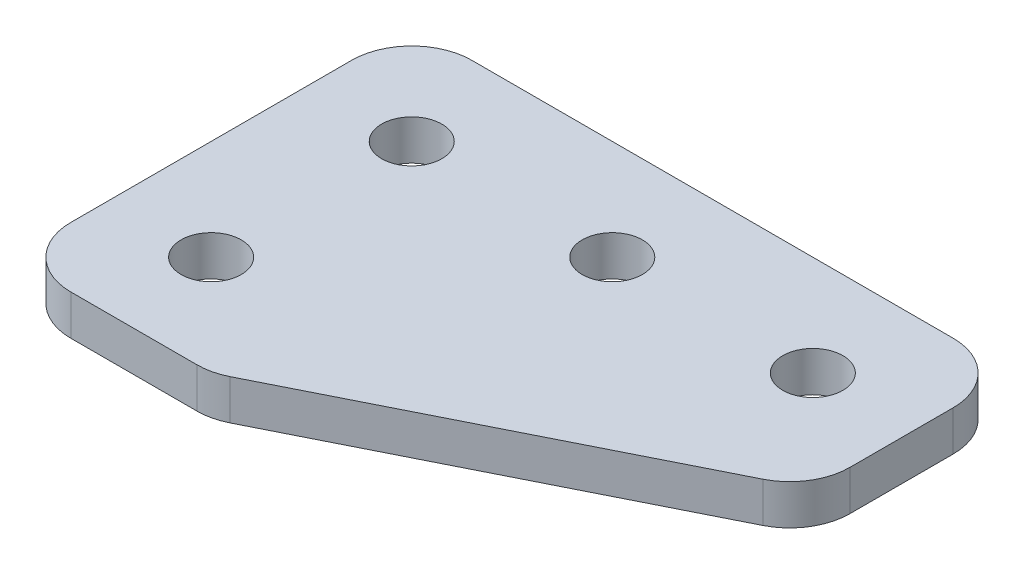
ISO-10303-21;
HEADER;
FILE_DESCRIPTION(('STEP AP214'),'2;1');
FILE_NAME('part.step','',(''),(''),'','','');
FILE_SCHEMA(('AUTOMOTIVE_DESIGN { 1 0 10303 214 1 1 1 1 }'));
ENDSEC;
DATA;
#1=APPLICATION_CONTEXT('core data for automotive mechanical design processes');
#2=APPLICATION_PROTOCOL_DEFINITION('international standard','automotive_design',2000,#1);
#3=PRODUCT_CONTEXT('',#1,'mechanical');
#4=PRODUCT('Part','Part','',(#3));
#5=PRODUCT_RELATED_PRODUCT_CATEGORY('part','',(#4));
#6=PRODUCT_DEFINITION_FORMATION('','',#4);
#7=PRODUCT_DEFINITION_CONTEXT('part definition',#1,'design');
#8=PRODUCT_DEFINITION('design','',#6,#7);
#9=PRODUCT_DEFINITION_SHAPE('','',#8);
#10=(LENGTH_UNIT() NAMED_UNIT(*) SI_UNIT(.MILLI.,.METRE.));
#11=(NAMED_UNIT(*) PLANE_ANGLE_UNIT() SI_UNIT($,.RADIAN.));
#12=(NAMED_UNIT(*) SI_UNIT($,.STERADIAN.) SOLID_ANGLE_UNIT());
#13=UNCERTAINTY_MEASURE_WITH_UNIT(LENGTH_MEASURE(1.E-05),#10,'distance_accuracy_value','');
#14=(GEOMETRIC_REPRESENTATION_CONTEXT(3) GLOBAL_UNCERTAINTY_ASSIGNED_CONTEXT((#13)) GLOBAL_UNIT_ASSIGNED_CONTEXT((#10,
#11,#12)) REPRESENTATION_CONTEXT('',''));
#15=CARTESIAN_POINT('',(0.,0.,0.));
#16=DIRECTION('',(0.,0.,1.));
#17=DIRECTION('',(1.,0.,0.));
#18=AXIS2_PLACEMENT_3D('',#15,#16,#17);
#19=CARTESIAN_POINT('',(0.,2.,0.));
#20=DIRECTION('',(0.,-1.,0.));
#21=DIRECTION('',(0.,0.,-1.));
#22=AXIS2_PLACEMENT_3D('',#19,#20,#21);
#23=PLANE('',#22);
#24=DIRECTION('',(0.894427190999916,0.,-0.447213595499958));
#25=VECTOR('',#24,1.);
#26=CARTESIAN_POINT('',(0.,2.,10.));
#27=LINE('',#26,#25);
#28=CARTESIAN_POINT('',(0.633436854000507,2.,9.68328157299975));
#29=VERTEX_POINT('',#28);
#30=CARTESIAN_POINT('',(18.3416407864999,2.,0.829179606750061));
#31=VERTEX_POINT('',#30);
#32=EDGE_CURVE('E158',#29,#31,#27,.T.);
#33=ORIENTED_EDGE('',*,*,#32,.T.);
#34=CARTESIAN_POINT('',(17.,2.,-1.85410196624968));
#35=DIRECTION('',(0.,-1.,0.));
#36=DIRECTION('',(0.,0.,-1.));
#37=AXIS2_PLACEMENT_3D('',#34,#35,#36);
#38=CIRCLE('',#37,3.);
#39=CARTESIAN_POINT('',(20.,2.,-1.85410196624968));
#40=VERTEX_POINT('',#39);
#41=EDGE_CURVE('E181',#31,#40,#38,.F.);
#42=ORIENTED_EDGE('',*,*,#41,.T.);
#43=DIRECTION('',(0.,0.,-1.));
#44=VECTOR('',#43,1.);
#45=CARTESIAN_POINT('',(20.,2.,0.));
#46=LINE('',#45,#44);
#47=CARTESIAN_POINT('',(20.,2.,-7.00000000000001));
#48=VERTEX_POINT('',#47);
#49=EDGE_CURVE('E140',#40,#48,#46,.T.);
#50=ORIENTED_EDGE('',*,*,#49,.T.);
#51=CARTESIAN_POINT('',(17.,2.,-7.00000000000001));
#52=DIRECTION('',(0.,-1.,0.));
#53=DIRECTION('',(0.,0.,-1.));
#54=AXIS2_PLACEMENT_3D('',#51,#52,#53);
#55=CIRCLE('',#54,3.);
#56=CARTESIAN_POINT('',(17.,2.,-10.));
#57=VERTEX_POINT('',#56);
#58=EDGE_CURVE('E179',#48,#57,#55,.F.);
#59=ORIENTED_EDGE('',*,*,#58,.T.);
#60=DIRECTION('',(-1.,0.,0.));
#61=VECTOR('',#60,1.);
#62=CARTESIAN_POINT('',(0.,2.,-10.));
#63=LINE('',#62,#61);
#64=CARTESIAN_POINT('',(-7.,2.,-10.));
#65=VERTEX_POINT('',#64);
#66=EDGE_CURVE('E196',#57,#65,#63,.T.);
#67=ORIENTED_EDGE('',*,*,#66,.T.);
#68=CARTESIAN_POINT('',(-7.,2.,-7.));
#69=DIRECTION('',(0.,-1.,0.));
#70=DIRECTION('',(0.,0.,-1.));
#71=AXIS2_PLACEMENT_3D('',#68,#69,#70);
#72=CIRCLE('',#71,3.);
#73=CARTESIAN_POINT('',(-10.,2.,-7.));
#74=VERTEX_POINT('',#73);
#75=EDGE_CURVE('E176',#65,#74,#72,.F.);
#76=ORIENTED_EDGE('',*,*,#75,.T.);
#77=DIRECTION('',(0.,0.,1.));
#78=VECTOR('',#77,1.);
#79=CARTESIAN_POINT('',(-10.,2.,-10.));
#80=LINE('',#79,#78);
#81=CARTESIAN_POINT('',(-10.,2.,7.));
#82=VERTEX_POINT('',#81);
#83=EDGE_CURVE('E206',#74,#82,#80,.T.);
#84=ORIENTED_EDGE('',*,*,#83,.T.);
#85=CARTESIAN_POINT('',(-7.,2.,7.));
#86=DIRECTION('',(0.,-1.,0.));
#87=DIRECTION('',(0.,0.,-1.));
#88=AXIS2_PLACEMENT_3D('',#85,#86,#87);
#89=CIRCLE('',#88,3.);
#90=CARTESIAN_POINT('',(-7.,2.,10.));
#91=VERTEX_POINT('',#90);
#92=EDGE_CURVE('E65',#82,#91,#89,.F.);
#93=ORIENTED_EDGE('',*,*,#92,.T.);
#94=DIRECTION('',(1.,0.,0.));
#95=VECTOR('',#94,1.);
#96=CARTESIAN_POINT('',(-10.,2.,10.));
#97=LINE('',#96,#95);
#98=CARTESIAN_POINT('',(-0.708203932499367,2.,10.));
#99=VERTEX_POINT('',#98);
#100=EDGE_CURVE('E217',#91,#99,#97,.T.);
#101=ORIENTED_EDGE('',*,*,#100,.T.);
#102=CARTESIAN_POINT('',(-0.708203932499368,2.,7.));
#103=DIRECTION('',(0.,-1.,0.));
#104=DIRECTION('',(0.,0.,-1.));
#105=AXIS2_PLACEMENT_3D('',#102,#103,#104);
#106=CIRCLE('',#105,3.);
#107=EDGE_CURVE('E182',#99,#29,#106,.F.);
#108=ORIENTED_EDGE('',*,*,#107,.T.);
#109=EDGE_LOOP('',(#33,#42,#50,#59,#67,#76,#84,#93,#101,#108));
#110=FACE_BOUND('',#109,.T.);
#111=CARTESIAN_POINT('',(5.,2.,-5.));
#112=DIRECTION('',(0.,1.,0.));
#113=DIRECTION('',(0.,0.,1.));
#114=AXIS2_PLACEMENT_3D('',#111,#112,#113);
#115=CIRCLE('',#114,1.5);
#116=CARTESIAN_POINT('',(5.,2.,-3.5));
#117=VERTEX_POINT('',#116);
#118=EDGE_CURVE('E149',#117,#117,#115,.T.);
#119=ORIENTED_EDGE('',*,*,#118,.F.);
#120=EDGE_LOOP('',(#119));
#121=FACE_BOUND('',#120,.T.);
#122=CARTESIAN_POINT('',(15.,2.,-5.));
#123=DIRECTION('',(0.,1.,0.));
#124=DIRECTION('',(0.,0.,1.));
#125=AXIS2_PLACEMENT_3D('',#122,#123,#124);
#126=CIRCLE('',#125,1.5);
#127=CARTESIAN_POINT('',(15.,2.,-3.5));
#128=VERTEX_POINT('',#127);
#129=EDGE_CURVE('E221',#128,#128,#126,.T.);
#130=ORIENTED_EDGE('',*,*,#129,.F.);
#131=EDGE_LOOP('',(#130));
#132=FACE_BOUND('',#131,.T.);
#133=CARTESIAN_POINT('',(-5.,2.,-5.));
#134=DIRECTION('',(0.,1.,0.));
#135=DIRECTION('',(0.,0.,1.));
#136=AXIS2_PLACEMENT_3D('',#133,#134,#135);
#137=CIRCLE('',#136,1.5);
#138=CARTESIAN_POINT('',(-5.,2.,-3.5));
#139=VERTEX_POINT('',#138);
#140=EDGE_CURVE('E226',#139,#139,#137,.T.);
#141=ORIENTED_EDGE('',*,*,#140,.F.);
#142=EDGE_LOOP('',(#141));
#143=FACE_BOUND('',#142,.T.);
#144=CARTESIAN_POINT('',(-5.,2.,5.));
#145=DIRECTION('',(0.,1.,0.));
#146=DIRECTION('',(0.,0.,1.));
#147=AXIS2_PLACEMENT_3D('',#144,#145,#146);
#148=CIRCLE('',#147,1.5);
#149=CARTESIAN_POINT('',(-5.,2.,6.5));
#150=VERTEX_POINT('',#149);
#151=EDGE_CURVE('E235',#150,#150,#148,.T.);
#152=ORIENTED_EDGE('',*,*,#151,.F.);
#153=EDGE_LOOP('',(#152));
#154=FACE_BOUND('',#153,.T.);
#155=ADVANCED_FACE('F41',(#110,#121,#132,#143,#154),#23,.F.);
#156=CARTESIAN_POINT('',(0.,0.,0.));
#157=DIRECTION('',(0.,-1.,0.));
#158=DIRECTION('',(0.,0.,-1.));
#159=AXIS2_PLACEMENT_3D('',#156,#157,#158);
#160=PLANE('',#159);
#161=CARTESIAN_POINT('',(-5.,0.,-5.));
#162=DIRECTION('',(0.,1.,0.));
#163=DIRECTION('',(0.,0.,1.));
#164=AXIS2_PLACEMENT_3D('',#161,#162,#163);
#165=CIRCLE('',#164,1.5);
#166=CARTESIAN_POINT('',(-5.,0.,-3.5));
#167=VERTEX_POINT('',#166);
#168=EDGE_CURVE('E232',#167,#167,#165,.T.);
#169=ORIENTED_EDGE('',*,*,#168,.T.);
#170=EDGE_LOOP('',(#169));
#171=FACE_BOUND('',#170,.T.);
#172=CARTESIAN_POINT('',(5.,0.,-5.));
#173=DIRECTION('',(0.,1.,0.));
#174=DIRECTION('',(0.,0.,1.));
#175=AXIS2_PLACEMENT_3D('',#172,#173,#174);
#176=CIRCLE('',#175,1.5);
#177=CARTESIAN_POINT('',(5.,0.,-3.5));
#178=VERTEX_POINT('',#177);
#179=EDGE_CURVE('E154',#178,#178,#176,.T.);
#180=ORIENTED_EDGE('',*,*,#179,.T.);
#181=EDGE_LOOP('',(#180));
#182=FACE_BOUND('',#181,.T.);
#183=DIRECTION('',(0.,0.,-1.));
#184=VECTOR('',#183,1.);
#185=CARTESIAN_POINT('',(20.,0.,0.));
#186=LINE('',#185,#184);
#187=CARTESIAN_POINT('',(20.,0.,-1.85410196624968));
#188=VERTEX_POINT('',#187);
#189=CARTESIAN_POINT('',(20.,0.,-7.00000000000001));
#190=VERTEX_POINT('',#189);
#191=EDGE_CURVE('E137',#188,#190,#186,.T.);
#192=ORIENTED_EDGE('',*,*,#191,.F.);
#193=CARTESIAN_POINT('',(17.,0.,-1.85410196624968));
#194=DIRECTION('',(0.,-1.,0.));
#195=DIRECTION('',(0.,0.,-1.));
#196=AXIS2_PLACEMENT_3D('',#193,#194,#195);
#197=CIRCLE('',#196,3.);
#198=CARTESIAN_POINT('',(18.3416407864999,0.,0.829179606750061));
#199=VERTEX_POINT('',#198);
#200=EDGE_CURVE('E118',#188,#199,#197,.T.);
#201=ORIENTED_EDGE('',*,*,#200,.T.);
#202=DIRECTION('',(0.894427190999916,0.,-0.447213595499958));
#203=VECTOR('',#202,1.);
#204=CARTESIAN_POINT('',(0.,0.,10.));
#205=LINE('',#204,#203);
#206=CARTESIAN_POINT('',(0.633436854000507,0.,9.68328157299975));
#207=VERTEX_POINT('',#206);
#208=EDGE_CURVE('E164',#207,#199,#205,.T.);
#209=ORIENTED_EDGE('',*,*,#208,.F.);
#210=CARTESIAN_POINT('',(-0.708203932499368,0.,7.));
#211=DIRECTION('',(0.,-1.,0.));
#212=DIRECTION('',(0.,0.,-1.));
#213=AXIS2_PLACEMENT_3D('',#210,#211,#212);
#214=CIRCLE('',#213,3.);
#215=CARTESIAN_POINT('',(-0.708203932499367,0.,10.));
#216=VERTEX_POINT('',#215);
#217=EDGE_CURVE('E132',#207,#216,#214,.T.);
#218=ORIENTED_EDGE('',*,*,#217,.T.);
#219=DIRECTION('',(1.,0.,0.));
#220=VECTOR('',#219,1.);
#221=CARTESIAN_POINT('',(-10.,0.,10.));
#222=LINE('',#221,#220);
#223=CARTESIAN_POINT('',(-7.,0.,10.));
#224=VERTEX_POINT('',#223);
#225=EDGE_CURVE('E162',#224,#216,#222,.T.);
#226=ORIENTED_EDGE('',*,*,#225,.F.);
#227=CARTESIAN_POINT('',(-7.,0.,7.));
#228=DIRECTION('',(0.,-1.,0.));
#229=DIRECTION('',(0.,0.,-1.));
#230=AXIS2_PLACEMENT_3D('',#227,#228,#229);
#231=CIRCLE('',#230,3.);
#232=CARTESIAN_POINT('',(-10.,0.,7.));
#233=VERTEX_POINT('',#232);
#234=EDGE_CURVE('E168',#224,#233,#231,.T.);
#235=ORIENTED_EDGE('',*,*,#234,.T.);
#236=DIRECTION('',(0.,0.,1.));
#237=VECTOR('',#236,1.);
#238=CARTESIAN_POINT('',(-10.,0.,0.));
#239=LINE('',#238,#237);
#240=CARTESIAN_POINT('',(-10.,0.,-7.));
#241=VERTEX_POINT('',#240);
#242=EDGE_CURVE('E155',#241,#233,#239,.T.);
#243=ORIENTED_EDGE('',*,*,#242,.F.);
#244=CARTESIAN_POINT('',(-7.,0.,-7.));
#245=DIRECTION('',(0.,-1.,0.));
#246=DIRECTION('',(0.,0.,-1.));
#247=AXIS2_PLACEMENT_3D('',#244,#245,#246);
#248=CIRCLE('',#247,3.);
#249=CARTESIAN_POINT('',(-7.,0.,-10.));
#250=VERTEX_POINT('',#249);
#251=EDGE_CURVE('E143',#241,#250,#248,.T.);
#252=ORIENTED_EDGE('',*,*,#251,.T.);
#253=DIRECTION('',(-1.,0.,0.));
#254=VECTOR('',#253,1.);
#255=CARTESIAN_POINT('',(0.,0.,-10.));
#256=LINE('',#255,#254);
#257=CARTESIAN_POINT('',(17.,0.,-10.));
#258=VERTEX_POINT('',#257);
#259=EDGE_CURVE('E146',#258,#250,#256,.T.);
#260=ORIENTED_EDGE('',*,*,#259,.F.);
#261=CARTESIAN_POINT('',(17.,0.,-7.00000000000001));
#262=DIRECTION('',(0.,-1.,0.));
#263=DIRECTION('',(0.,0.,-1.));
#264=AXIS2_PLACEMENT_3D('',#261,#262,#263);
#265=CIRCLE('',#264,3.);
#266=EDGE_CURVE('E150',#258,#190,#265,.T.);
#267=ORIENTED_EDGE('',*,*,#266,.T.);
#268=EDGE_LOOP('',(#192,#201,#209,#218,#226,#235,#243,#252,#260,#267));
#269=FACE_BOUND('',#268,.T.);
#270=CARTESIAN_POINT('',(15.,0.,-5.));
#271=DIRECTION('',(0.,1.,0.));
#272=DIRECTION('',(0.,0.,1.));
#273=AXIS2_PLACEMENT_3D('',#270,#271,#272);
#274=CIRCLE('',#273,1.5);
#275=CARTESIAN_POINT('',(15.,0.,-3.5));
#276=VERTEX_POINT('',#275);
#277=EDGE_CURVE('E227',#276,#276,#274,.T.);
#278=ORIENTED_EDGE('',*,*,#277,.T.);
#279=EDGE_LOOP('',(#278));
#280=FACE_BOUND('',#279,.T.);
#281=CARTESIAN_POINT('',(-5.,0.,5.));
#282=DIRECTION('',(0.,1.,0.));
#283=DIRECTION('',(0.,0.,1.));
#284=AXIS2_PLACEMENT_3D('',#281,#282,#283);
#285=CIRCLE('',#284,1.5);
#286=CARTESIAN_POINT('',(-5.,0.,6.5));
#287=VERTEX_POINT('',#286);
#288=EDGE_CURVE('E236',#287,#287,#285,.T.);
#289=ORIENTED_EDGE('',*,*,#288,.T.);
#290=EDGE_LOOP('',(#289));
#291=FACE_BOUND('',#290,.T.);
#292=ADVANCED_FACE('F145',(#171,#182,#269,#280,#291),#160,.T.);
#293=CARTESIAN_POINT('',(20.,2.,0.));
#294=DIRECTION('',(-1.,0.,0.));
#295=DIRECTION('',(0.,0.,1.));
#296=AXIS2_PLACEMENT_3D('',#293,#294,#295);
#297=PLANE('',#296);
#298=ORIENTED_EDGE('',*,*,#49,.F.);
#299=DIRECTION('',(0.,-1.,0.));
#300=VECTOR('',#299,1.);
#301=CARTESIAN_POINT('',(20.,2.,-1.85410196624968));
#302=LINE('',#301,#300);
#303=EDGE_CURVE('E123',#40,#188,#302,.T.);
#304=ORIENTED_EDGE('',*,*,#303,.T.);
#305=ORIENTED_EDGE('',*,*,#191,.T.);
#306=DIRECTION('',(0.,-1.,0.));
#307=VECTOR('',#306,1.);
#308=CARTESIAN_POINT('',(20.,2.,-7.00000000000001));
#309=LINE('',#308,#307);
#310=EDGE_CURVE('E142',#190,#48,#309,.F.);
#311=ORIENTED_EDGE('',*,*,#310,.T.);
#312=EDGE_LOOP('',(#298,#304,#305,#311));
#313=FACE_BOUND('',#312,.T.);
#314=ADVANCED_FACE('F136',(#313),#297,.F.);
#315=CARTESIAN_POINT('',(0.,2.,-10.));
#316=DIRECTION('',(0.,0.,1.));
#317=DIRECTION('',(1.,0.,0.));
#318=AXIS2_PLACEMENT_3D('',#315,#316,#317);
#319=PLANE('',#318);
#320=ORIENTED_EDGE('',*,*,#66,.F.);
#321=DIRECTION('',(0.,-1.,0.));
#322=VECTOR('',#321,1.);
#323=CARTESIAN_POINT('',(17.,2.,-10.));
#324=LINE('',#323,#322);
#325=EDGE_CURVE('E11',#57,#258,#324,.T.);
#326=ORIENTED_EDGE('',*,*,#325,.T.);
#327=ORIENTED_EDGE('',*,*,#259,.T.);
#328=DIRECTION('',(0.,-1.,0.));
#329=VECTOR('',#328,1.);
#330=CARTESIAN_POINT('',(-7.,2.,-10.));
#331=LINE('',#330,#329);
#332=EDGE_CURVE('E47',#250,#65,#331,.F.);
#333=ORIENTED_EDGE('',*,*,#332,.T.);
#334=EDGE_LOOP('',(#320,#326,#327,#333));
#335=FACE_BOUND('',#334,.T.);
#336=ADVANCED_FACE('F197',(#335),#319,.F.);
#337=CARTESIAN_POINT('',(-10.,2.,0.));
#338=DIRECTION('',(1.,0.,0.));
#339=DIRECTION('',(0.,0.,-1.));
#340=AXIS2_PLACEMENT_3D('',#337,#338,#339);
#341=PLANE('',#340);
#342=ORIENTED_EDGE('',*,*,#242,.T.);
#343=DIRECTION('',(0.,-1.,0.));
#344=VECTOR('',#343,1.);
#345=CARTESIAN_POINT('',(-10.,2.,7.));
#346=LINE('',#345,#344);
#347=EDGE_CURVE('E192',#233,#82,#346,.F.);
#348=ORIENTED_EDGE('',*,*,#347,.T.);
#349=ORIENTED_EDGE('',*,*,#83,.F.);
#350=DIRECTION('',(0.,-1.,0.));
#351=VECTOR('',#350,1.);
#352=CARTESIAN_POINT('',(-10.,2.,-7.));
#353=LINE('',#352,#351);
#354=EDGE_CURVE('E186',#74,#241,#353,.T.);
#355=ORIENTED_EDGE('',*,*,#354,.T.);
#356=EDGE_LOOP('',(#342,#348,#349,#355));
#357=FACE_BOUND('',#356,.T.);
#358=ADVANCED_FACE('F211',(#357),#341,.F.);
#359=CARTESIAN_POINT('',(-10.,2.,10.));
#360=DIRECTION('',(0.,0.,-1.));
#361=DIRECTION('',(-1.,0.,0.));
#362=AXIS2_PLACEMENT_3D('',#359,#360,#361);
#363=PLANE('',#362);
#364=ORIENTED_EDGE('',*,*,#225,.T.);
#365=DIRECTION('',(0.,-1.,0.));
#366=VECTOR('',#365,1.);
#367=CARTESIAN_POINT('',(-0.708203932499367,2.,10.));
#368=LINE('',#367,#366);
#369=EDGE_CURVE('E57',#216,#99,#368,.F.);
#370=ORIENTED_EDGE('',*,*,#369,.T.);
#371=ORIENTED_EDGE('',*,*,#100,.F.);
#372=DIRECTION('',(0.,-1.,0.));
#373=VECTOR('',#372,1.);
#374=CARTESIAN_POINT('',(-7.,2.,10.));
#375=LINE('',#374,#373);
#376=EDGE_CURVE('E183',#91,#224,#375,.T.);
#377=ORIENTED_EDGE('',*,*,#376,.T.);
#378=EDGE_LOOP('',(#364,#370,#371,#377));
#379=FACE_BOUND('',#378,.T.);
#380=ADVANCED_FACE('F220',(#379),#363,.F.);
#381=CARTESIAN_POINT('',(0.,2.,10.));
#382=DIRECTION('',(-0.447213595499958,0.,-0.894427190999916));
#383=DIRECTION('',(-0.894427190999916,0.,0.447213595499958));
#384=AXIS2_PLACEMENT_3D('',#381,#382,#383);
#385=PLANE('',#384);
#386=ORIENTED_EDGE('',*,*,#208,.T.);
#387=DIRECTION('',(0.,-1.,0.));
#388=VECTOR('',#387,1.);
#389=CARTESIAN_POINT('',(18.3416407864999,2.,0.829179606750063));
#390=LINE('',#389,#388);
#391=EDGE_CURVE('E125',#199,#31,#390,.F.);
#392=ORIENTED_EDGE('',*,*,#391,.T.);
#393=ORIENTED_EDGE('',*,*,#32,.F.);
#394=DIRECTION('',(0.,-1.,0.));
#395=VECTOR('',#394,1.);
#396=CARTESIAN_POINT('',(0.633436854000507,2.,9.68328157299975));
#397=LINE('',#396,#395);
#398=EDGE_CURVE('E128',#29,#207,#397,.T.);
#399=ORIENTED_EDGE('',*,*,#398,.T.);
#400=EDGE_LOOP('',(#386,#392,#393,#399));
#401=FACE_BOUND('',#400,.T.);
#402=ADVANCED_FACE('F259',(#401),#385,.F.);
#403=CARTESIAN_POINT('',(5.,2.,-5.));
#404=DIRECTION('',(0.,-1.,0.));
#405=DIRECTION('',(0.,0.,-1.));
#406=AXIS2_PLACEMENT_3D('',#403,#404,#405);
#407=CYLINDRICAL_SURFACE('',#406,1.5);
#408=ORIENTED_EDGE('',*,*,#118,.T.);
#409=EDGE_LOOP('',(#408));
#410=FACE_BOUND('',#409,.T.);
#411=ORIENTED_EDGE('',*,*,#179,.F.);
#412=EDGE_LOOP('',(#411));
#413=FACE_BOUND('',#412,.T.);
#414=ADVANCED_FACE('F258',(#410,#413),#407,.F.);
#415=CARTESIAN_POINT('',(15.,2.,-5.));
#416=DIRECTION('',(0.,-1.,0.));
#417=DIRECTION('',(0.,0.,-1.));
#418=AXIS2_PLACEMENT_3D('',#415,#416,#417);
#419=CYLINDRICAL_SURFACE('',#418,1.5);
#420=ORIENTED_EDGE('',*,*,#129,.T.);
#421=EDGE_LOOP('',(#420));
#422=FACE_BOUND('',#421,.T.);
#423=ORIENTED_EDGE('',*,*,#277,.F.);
#424=EDGE_LOOP('',(#423));
#425=FACE_BOUND('',#424,.T.);
#426=ADVANCED_FACE('F327',(#422,#425),#419,.F.);
#427=CARTESIAN_POINT('',(-5.,2.,-5.));
#428=DIRECTION('',(0.,-1.,0.));
#429=DIRECTION('',(0.,0.,-1.));
#430=AXIS2_PLACEMENT_3D('',#427,#428,#429);
#431=CYLINDRICAL_SURFACE('',#430,1.5);
#432=ORIENTED_EDGE('',*,*,#140,.T.);
#433=EDGE_LOOP('',(#432));
#434=FACE_BOUND('',#433,.T.);
#435=ORIENTED_EDGE('',*,*,#168,.F.);
#436=EDGE_LOOP('',(#435));
#437=FACE_BOUND('',#436,.T.);
#438=ADVANCED_FACE('F317',(#434,#437),#431,.F.);
#439=CARTESIAN_POINT('',(-5.,2.,5.));
#440=DIRECTION('',(0.,-1.,0.));
#441=DIRECTION('',(0.,0.,-1.));
#442=AXIS2_PLACEMENT_3D('',#439,#440,#441);
#443=CYLINDRICAL_SURFACE('',#442,1.5);
#444=ORIENTED_EDGE('',*,*,#151,.T.);
#445=EDGE_LOOP('',(#444));
#446=FACE_BOUND('',#445,.T.);
#447=ORIENTED_EDGE('',*,*,#288,.F.);
#448=EDGE_LOOP('',(#447));
#449=FACE_BOUND('',#448,.T.);
#450=ADVANCED_FACE('F241',(#446,#449),#443,.F.);
#451=CARTESIAN_POINT('',(17.,2.,-1.85410196624968));
#452=DIRECTION('',(0.,-1.,0.));
#453=DIRECTION('',(0.,0.,-1.));
#454=AXIS2_PLACEMENT_3D('',#451,#452,#453);
#455=CYLINDRICAL_SURFACE('',#454,3.);
#456=ORIENTED_EDGE('',*,*,#41,.F.);
#457=ORIENTED_EDGE('',*,*,#391,.F.);
#458=ORIENTED_EDGE('',*,*,#200,.F.);
#459=ORIENTED_EDGE('',*,*,#303,.F.);
#460=EDGE_LOOP('',(#456,#457,#458,#459));
#461=FACE_BOUND('',#460,.T.);
#462=ADVANCED_FACE('F124',(#461),#455,.T.);
#463=CARTESIAN_POINT('',(-0.708203932499368,2.,7.));
#464=DIRECTION('',(0.,-1.,0.));
#465=DIRECTION('',(0.,0.,-1.));
#466=AXIS2_PLACEMENT_3D('',#463,#464,#465);
#467=CYLINDRICAL_SURFACE('',#466,3.);
#468=ORIENTED_EDGE('',*,*,#107,.F.);
#469=ORIENTED_EDGE('',*,*,#369,.F.);
#470=ORIENTED_EDGE('',*,*,#217,.F.);
#471=ORIENTED_EDGE('',*,*,#398,.F.);
#472=EDGE_LOOP('',(#468,#469,#470,#471));
#473=FACE_BOUND('',#472,.T.);
#474=ADVANCED_FACE('F272',(#473),#467,.T.);
#475=CARTESIAN_POINT('',(-7.,2.,7.));
#476=DIRECTION('',(0.,-1.,0.));
#477=DIRECTION('',(0.,0.,-1.));
#478=AXIS2_PLACEMENT_3D('',#475,#476,#477);
#479=CYLINDRICAL_SURFACE('',#478,3.);
#480=ORIENTED_EDGE('',*,*,#92,.F.);
#481=ORIENTED_EDGE('',*,*,#347,.F.);
#482=ORIENTED_EDGE('',*,*,#234,.F.);
#483=ORIENTED_EDGE('',*,*,#376,.F.);
#484=EDGE_LOOP('',(#480,#481,#482,#483));
#485=FACE_BOUND('',#484,.T.);
#486=ADVANCED_FACE('F216',(#485),#479,.T.);
#487=CARTESIAN_POINT('',(17.,2.,-7.00000000000001));
#488=DIRECTION('',(0.,-1.,0.));
#489=DIRECTION('',(0.,0.,-1.));
#490=AXIS2_PLACEMENT_3D('',#487,#488,#489);
#491=CYLINDRICAL_SURFACE('',#490,3.);
#492=ORIENTED_EDGE('',*,*,#58,.F.);
#493=ORIENTED_EDGE('',*,*,#310,.F.);
#494=ORIENTED_EDGE('',*,*,#266,.F.);
#495=ORIENTED_EDGE('',*,*,#325,.F.);
#496=EDGE_LOOP('',(#492,#493,#494,#495));
#497=FACE_BOUND('',#496,.T.);
#498=ADVANCED_FACE('F279',(#497),#491,.T.);
#499=CARTESIAN_POINT('',(-7.,2.,-7.));
#500=DIRECTION('',(0.,-1.,0.));
#501=DIRECTION('',(0.,0.,-1.));
#502=AXIS2_PLACEMENT_3D('',#499,#500,#501);
#503=CYLINDRICAL_SURFACE('',#502,3.);
#504=ORIENTED_EDGE('',*,*,#75,.F.);
#505=ORIENTED_EDGE('',*,*,#332,.F.);
#506=ORIENTED_EDGE('',*,*,#251,.F.);
#507=ORIENTED_EDGE('',*,*,#354,.F.);
#508=EDGE_LOOP('',(#504,#505,#506,#507));
#509=FACE_BOUND('',#508,.T.);
#510=ADVANCED_FACE('F43',(#509),#503,.T.);
#511=CLOSED_SHELL('',(#155,#292,#314,#336,#358,#380,#402,#414,#426,#438,#450,#462,#474,#486,
#498,#510));
#512=MANIFOLD_SOLID_BREP('B2',#511);
#513=ADVANCED_BREP_SHAPE_REPRESENTATION('',(#18,#512),#14);
#514=SHAPE_DEFINITION_REPRESENTATION(#9,#513);
ENDSEC;
END-ISO-10303-21;
